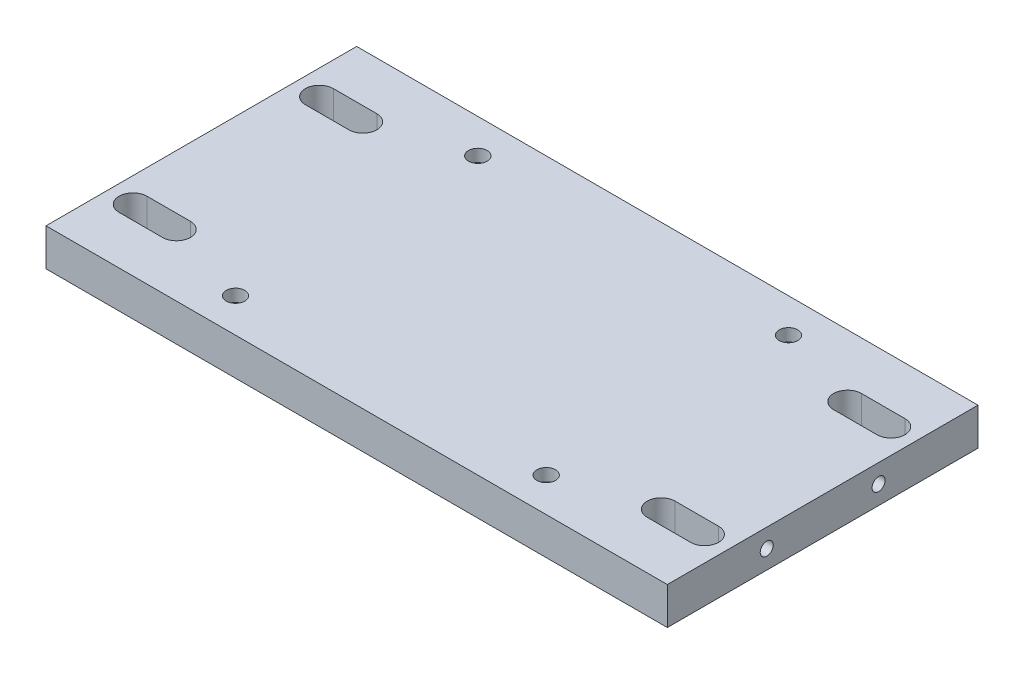
ISO-10303-21;
HEADER;
FILE_DESCRIPTION(('STEP AP214'),'2;1');
FILE_NAME('part.step','',(''),(''),'','','');
FILE_SCHEMA(('AUTOMOTIVE_DESIGN { 1 0 10303 214 1 1 1 1 }'));
ENDSEC;
DATA;
#1=APPLICATION_CONTEXT('core data for automotive mechanical design processes');
#2=APPLICATION_PROTOCOL_DEFINITION('international standard','automotive_design',2000,#1);
#3=PRODUCT_CONTEXT('',#1,'mechanical');
#4=PRODUCT('Part','Part','',(#3));
#5=PRODUCT_RELATED_PRODUCT_CATEGORY('part','',(#4));
#6=PRODUCT_DEFINITION_FORMATION('','',#4);
#7=PRODUCT_DEFINITION_CONTEXT('part definition',#1,'design');
#8=PRODUCT_DEFINITION('design','',#6,#7);
#9=PRODUCT_DEFINITION_SHAPE('','',#8);
#10=(LENGTH_UNIT() NAMED_UNIT(*) SI_UNIT(.MILLI.,.METRE.));
#11=(NAMED_UNIT(*) PLANE_ANGLE_UNIT() SI_UNIT($,.RADIAN.));
#12=(NAMED_UNIT(*) SI_UNIT($,.STERADIAN.) SOLID_ANGLE_UNIT());
#13=UNCERTAINTY_MEASURE_WITH_UNIT(LENGTH_MEASURE(1.E-05),#10,'distance_accuracy_value','');
#14=(GEOMETRIC_REPRESENTATION_CONTEXT(3) GLOBAL_UNCERTAINTY_ASSIGNED_CONTEXT((#13)) GLOBAL_UNIT_ASSIGNED_CONTEXT((#10,
#11,#12)) REPRESENTATION_CONTEXT('',''));
#15=CARTESIAN_POINT('',(0.,0.,0.));
#16=DIRECTION('',(0.,0.,1.));
#17=DIRECTION('',(1.,0.,0.));
#18=AXIS2_PLACEMENT_3D('',#15,#16,#17);
#19=CARTESIAN_POINT('',(-200.,12.,50.));
#20=DIRECTION('',(1.,0.,0.));
#21=DIRECTION('',(0.,0.,-1.));
#22=AXIS2_PLACEMENT_3D('',#19,#20,#21);
#23=PLANE('',#22);
#24=DIRECTION('',(0.,0.,1.));
#25=VECTOR('',#24,1.);
#26=CARTESIAN_POINT('',(-200.,0.,50.));
#27=LINE('',#26,#25);
#28=CARTESIAN_POINT('',(-200.,0.,-50.));
#29=VERTEX_POINT('',#28);
#30=CARTESIAN_POINT('',(-200.,0.,50.));
#31=VERTEX_POINT('',#30);
#32=EDGE_CURVE('E363',#29,#31,#27,.T.);
#33=ORIENTED_EDGE('',*,*,#32,.T.);
#34=DIRECTION('',(0.,-1.,0.));
#35=VECTOR('',#34,1.);
#36=CARTESIAN_POINT('',(-200.,12.,50.));
#37=LINE('',#36,#35);
#38=CARTESIAN_POINT('',(-200.,12.,50.));
#39=VERTEX_POINT('',#38);
#40=EDGE_CURVE('E11',#39,#31,#37,.T.);
#41=ORIENTED_EDGE('',*,*,#40,.F.);
#42=DIRECTION('',(0.,0.,1.));
#43=VECTOR('',#42,1.);
#44=CARTESIAN_POINT('',(-200.,12.,50.));
#45=LINE('',#44,#43);
#46=CARTESIAN_POINT('',(-200.,12.,-50.));
#47=VERTEX_POINT('',#46);
#48=EDGE_CURVE('E370',#47,#39,#45,.T.);
#49=ORIENTED_EDGE('',*,*,#48,.F.);
#50=DIRECTION('',(0.,-1.,0.));
#51=VECTOR('',#50,1.);
#52=CARTESIAN_POINT('',(-200.,12.,-50.));
#53=LINE('',#52,#51);
#54=EDGE_CURVE('E380',#47,#29,#53,.T.);
#55=ORIENTED_EDGE('',*,*,#54,.T.);
#56=EDGE_LOOP('',(#33,#41,#49,#55));
#57=FACE_BOUND('',#56,.T.);
#58=ADVANCED_FACE('F36',(#57),#23,.F.);
#59=CARTESIAN_POINT('',(-200.,12.,50.));
#60=DIRECTION('',(0.,0.,-1.));
#61=DIRECTION('',(-1.,0.,0.));
#62=AXIS2_PLACEMENT_3D('',#59,#60,#61);
#63=PLANE('',#62);
#64=DIRECTION('',(1.,0.,0.));
#65=VECTOR('',#64,1.);
#66=CARTESIAN_POINT('',(-200.,0.,50.));
#67=LINE('',#66,#65);
#68=CARTESIAN_POINT('',(0.,0.,50.));
#69=VERTEX_POINT('',#68);
#70=EDGE_CURVE('E383',#31,#69,#67,.T.);
#71=ORIENTED_EDGE('',*,*,#70,.T.);
#72=DIRECTION('',(0.,-1.,0.));
#73=VECTOR('',#72,1.);
#74=CARTESIAN_POINT('',(0.,12.,50.));
#75=LINE('',#74,#73);
#76=CARTESIAN_POINT('',(0.,12.,50.));
#77=VERTEX_POINT('',#76);
#78=EDGE_CURVE('E43',#77,#69,#75,.T.);
#79=ORIENTED_EDGE('',*,*,#78,.F.);
#80=DIRECTION('',(1.,0.,0.));
#81=VECTOR('',#80,1.);
#82=CARTESIAN_POINT('',(-200.,12.,50.));
#83=LINE('',#82,#81);
#84=EDGE_CURVE('E373',#39,#77,#83,.T.);
#85=ORIENTED_EDGE('',*,*,#84,.F.);
#86=ORIENTED_EDGE('',*,*,#40,.T.);
#87=EDGE_LOOP('',(#71,#79,#85,#86));
#88=FACE_BOUND('',#87,.T.);
#89=ADVANCED_FACE('F413',(#88),#63,.F.);
#90=CARTESIAN_POINT('',(0.,12.,50.));
#91=DIRECTION('',(-1.,0.,0.));
#92=DIRECTION('',(0.,0.,1.));
#93=AXIS2_PLACEMENT_3D('',#90,#91,#92);
#94=PLANE('',#93);
#95=CARTESIAN_POINT('',(0.,6.,-18.));
#96=DIRECTION('',(1.,0.,0.));
#97=DIRECTION('',(0.,0.,-1.));
#98=AXIS2_PLACEMENT_3D('',#95,#96,#97);
#99=CIRCLE('',#98,2.1);
#100=CARTESIAN_POINT('',(0.,6.,-20.1));
#101=VERTEX_POINT('',#100);
#102=EDGE_CURVE('E187',#101,#101,#99,.T.);
#103=ORIENTED_EDGE('',*,*,#102,.F.);
#104=EDGE_LOOP('',(#103));
#105=FACE_BOUND('',#104,.T.);
#106=CARTESIAN_POINT('',(0.,6.,18.));
#107=DIRECTION('',(1.,0.,0.));
#108=DIRECTION('',(0.,0.,-1.));
#109=AXIS2_PLACEMENT_3D('',#106,#107,#108);
#110=CIRCLE('',#109,2.1);
#111=CARTESIAN_POINT('',(0.,6.,15.9));
#112=VERTEX_POINT('',#111);
#113=EDGE_CURVE('E186',#112,#112,#110,.T.);
#114=ORIENTED_EDGE('',*,*,#113,.F.);
#115=EDGE_LOOP('',(#114));
#116=FACE_BOUND('',#115,.T.);
#117=DIRECTION('',(0.,0.,-1.));
#118=VECTOR('',#117,1.);
#119=CARTESIAN_POINT('',(0.,0.,50.));
#120=LINE('',#119,#118);
#121=CARTESIAN_POINT('',(0.,0.,-50.));
#122=VERTEX_POINT('',#121);
#123=EDGE_CURVE('E385',#69,#122,#120,.T.);
#124=ORIENTED_EDGE('',*,*,#123,.T.);
#125=DIRECTION('',(0.,-1.,0.));
#126=VECTOR('',#125,1.);
#127=CARTESIAN_POINT('',(0.,12.,-50.));
#128=LINE('',#127,#126);
#129=CARTESIAN_POINT('',(0.,12.,-50.));
#130=VERTEX_POINT('',#129);
#131=EDGE_CURVE('E390',#130,#122,#128,.T.);
#132=ORIENTED_EDGE('',*,*,#131,.F.);
#133=DIRECTION('',(0.,0.,-1.));
#134=VECTOR('',#133,1.);
#135=CARTESIAN_POINT('',(0.,12.,50.));
#136=LINE('',#135,#134);
#137=EDGE_CURVE('E376',#77,#130,#136,.T.);
#138=ORIENTED_EDGE('',*,*,#137,.F.);
#139=ORIENTED_EDGE('',*,*,#78,.T.);
#140=EDGE_LOOP('',(#124,#132,#138,#139));
#141=FACE_BOUND('',#140,.T.);
#142=ADVANCED_FACE('F397',(#105,#116,#141),#94,.F.);
#143=CARTESIAN_POINT('',(-200.,12.,-50.));
#144=DIRECTION('',(0.,0.,1.));
#145=DIRECTION('',(1.,0.,0.));
#146=AXIS2_PLACEMENT_3D('',#143,#144,#145);
#147=PLANE('',#146);
#148=DIRECTION('',(-1.,0.,0.));
#149=VECTOR('',#148,1.);
#150=CARTESIAN_POINT('',(-200.,0.,-50.));
#151=LINE('',#150,#149);
#152=EDGE_CURVE('E374',#122,#29,#151,.T.);
#153=ORIENTED_EDGE('',*,*,#152,.T.);
#154=ORIENTED_EDGE('',*,*,#54,.F.);
#155=DIRECTION('',(-1.,0.,0.));
#156=VECTOR('',#155,1.);
#157=CARTESIAN_POINT('',(-200.,12.,-50.));
#158=LINE('',#157,#156);
#159=EDGE_CURVE('E378',#130,#47,#158,.T.);
#160=ORIENTED_EDGE('',*,*,#159,.F.);
#161=ORIENTED_EDGE('',*,*,#131,.T.);
#162=EDGE_LOOP('',(#153,#154,#160,#161));
#163=FACE_BOUND('',#162,.T.);
#164=ADVANCED_FACE('F406',(#163),#147,.F.);
#165=CARTESIAN_POINT('',(-200.,12.,-50.));
#166=DIRECTION('',(0.,-1.,0.));
#167=DIRECTION('',(0.,0.,-1.));
#168=AXIS2_PLACEMENT_3D('',#165,#166,#167);
#169=PLANE('',#168);
#170=CARTESIAN_POINT('',(-150.,12.,39.));
#171=DIRECTION('',(0.,-1.,0.));
#172=DIRECTION('',(0.,0.,-1.));
#173=AXIS2_PLACEMENT_3D('',#170,#171,#172);
#174=CIRCLE('',#173,3.);
#175=CARTESIAN_POINT('',(-150.,12.,36.));
#176=VERTEX_POINT('',#175);
#177=EDGE_CURVE('E206',#176,#176,#174,.T.);
#178=ORIENTED_EDGE('',*,*,#177,.T.);
#179=EDGE_LOOP('',(#178));
#180=FACE_BOUND('',#179,.T.);
#181=CARTESIAN_POINT('',(-50.,12.,39.));
#182=DIRECTION('',(0.,-1.,0.));
#183=DIRECTION('',(0.,0.,-1.));
#184=AXIS2_PLACEMENT_3D('',#181,#182,#183);
#185=CIRCLE('',#184,3.);
#186=CARTESIAN_POINT('',(-50.,12.,36.));
#187=VERTEX_POINT('',#186);
#188=EDGE_CURVE('E218',#187,#187,#185,.T.);
#189=ORIENTED_EDGE('',*,*,#188,.T.);
#190=EDGE_LOOP('',(#189));
#191=FACE_BOUND('',#190,.T.);
#192=CARTESIAN_POINT('',(-150.,12.,-39.));
#193=DIRECTION('',(0.,-1.,0.));
#194=DIRECTION('',(0.,0.,-1.));
#195=AXIS2_PLACEMENT_3D('',#192,#193,#194);
#196=CIRCLE('',#195,3.);
#197=CARTESIAN_POINT('',(-150.,12.,-42.));
#198=VERTEX_POINT('',#197);
#199=EDGE_CURVE('E230',#198,#198,#196,.T.);
#200=ORIENTED_EDGE('',*,*,#199,.T.);
#201=EDGE_LOOP('',(#200));
#202=FACE_BOUND('',#201,.T.);
#203=CARTESIAN_POINT('',(-50.,12.,-39.));
#204=DIRECTION('',(0.,-1.,0.));
#205=DIRECTION('',(0.,0.,-1.));
#206=AXIS2_PLACEMENT_3D('',#203,#204,#205);
#207=CIRCLE('',#206,3.);
#208=CARTESIAN_POINT('',(-50.,12.,-42.));
#209=VERTEX_POINT('',#208);
#210=EDGE_CURVE('E242',#209,#209,#207,.T.);
#211=ORIENTED_EDGE('',*,*,#210,.T.);
#212=EDGE_LOOP('',(#211));
#213=FACE_BOUND('',#212,.T.);
#214=DIRECTION('',(1.,0.,0.));
#215=VECTOR('',#214,1.);
#216=CARTESIAN_POINT('',(-22.,12.,34.5));
#217=LINE('',#216,#215);
#218=CARTESIAN_POINT('',(-22.,12.,34.5));
#219=VERTEX_POINT('',#218);
#220=CARTESIAN_POINT('',(-8.00000000000001,12.,34.5));
#221=VERTEX_POINT('',#220);
#222=EDGE_CURVE('E258',#219,#221,#217,.T.);
#223=ORIENTED_EDGE('',*,*,#222,.F.);
#224=CARTESIAN_POINT('',(-22.,12.,30.));
#225=DIRECTION('',(0.,1.,0.));
#226=DIRECTION('',(0.,0.,1.));
#227=AXIS2_PLACEMENT_3D('',#224,#225,#226);
#228=CIRCLE('',#227,4.5);
#229=CARTESIAN_POINT('',(-22.,12.,25.5));
#230=VERTEX_POINT('',#229);
#231=EDGE_CURVE('E50',#230,#219,#228,.T.);
#232=ORIENTED_EDGE('',*,*,#231,.F.);
#233=DIRECTION('',(-1.,0.,0.));
#234=VECTOR('',#233,1.);
#235=CARTESIAN_POINT('',(-22.,12.,25.5));
#236=LINE('',#235,#234);
#237=CARTESIAN_POINT('',(-8.00000000000001,12.,25.5));
#238=VERTEX_POINT('',#237);
#239=EDGE_CURVE('E249',#238,#230,#236,.T.);
#240=ORIENTED_EDGE('',*,*,#239,.F.);
#241=CARTESIAN_POINT('',(-8.00000000000001,12.,30.));
#242=DIRECTION('',(0.,1.,0.));
#243=DIRECTION('',(0.,0.,1.));
#244=AXIS2_PLACEMENT_3D('',#241,#242,#243);
#245=CIRCLE('',#244,4.5);
#246=EDGE_CURVE('E261',#221,#238,#245,.T.);
#247=ORIENTED_EDGE('',*,*,#246,.F.);
#248=EDGE_LOOP('',(#223,#232,#240,#247));
#249=FACE_BOUND('',#248,.T.);
#250=DIRECTION('',(1.,0.,0.));
#251=VECTOR('',#250,1.);
#252=CARTESIAN_POINT('',(-22.,12.,-25.5));
#253=LINE('',#252,#251);
#254=CARTESIAN_POINT('',(-22.,12.,-25.5));
#255=VERTEX_POINT('',#254);
#256=CARTESIAN_POINT('',(-8.00000000000002,12.,-25.5));
#257=VERTEX_POINT('',#256);
#258=EDGE_CURVE('E289',#255,#257,#253,.T.);
#259=ORIENTED_EDGE('',*,*,#258,.F.);
#260=CARTESIAN_POINT('',(-22.,12.,-30.));
#261=DIRECTION('',(0.,1.,0.));
#262=DIRECTION('',(0.,0.,1.));
#263=AXIS2_PLACEMENT_3D('',#260,#261,#262);
#264=CIRCLE('',#263,4.5);
#265=CARTESIAN_POINT('',(-22.,12.,-34.5));
#266=VERTEX_POINT('',#265);
#267=EDGE_CURVE('E268',#266,#255,#264,.T.);
#268=ORIENTED_EDGE('',*,*,#267,.F.);
#269=DIRECTION('',(-1.,0.,0.));
#270=VECTOR('',#269,1.);
#271=CARTESIAN_POINT('',(-22.,12.,-34.5));
#272=LINE('',#271,#270);
#273=CARTESIAN_POINT('',(-8.00000000000002,12.,-34.5));
#274=VERTEX_POINT('',#273);
#275=EDGE_CURVE('E278',#274,#266,#272,.T.);
#276=ORIENTED_EDGE('',*,*,#275,.F.);
#277=CARTESIAN_POINT('',(-8.00000000000002,12.,-30.));
#278=DIRECTION('',(0.,1.,0.));
#279=DIRECTION('',(0.,0.,1.));
#280=AXIS2_PLACEMENT_3D('',#277,#278,#279);
#281=CIRCLE('',#280,4.5);
#282=EDGE_CURVE('E292',#257,#274,#281,.T.);
#283=ORIENTED_EDGE('',*,*,#282,.F.);
#284=EDGE_LOOP('',(#259,#268,#276,#283));
#285=FACE_BOUND('',#284,.T.);
#286=DIRECTION('',(1.,0.,0.));
#287=VECTOR('',#286,1.);
#288=CARTESIAN_POINT('',(-192.,12.,-25.5));
#289=LINE('',#288,#287);
#290=CARTESIAN_POINT('',(-192.,12.,-25.5));
#291=VERTEX_POINT('',#290);
#292=CARTESIAN_POINT('',(-178.,12.,-25.5));
#293=VERTEX_POINT('',#292);
#294=EDGE_CURVE('E321',#291,#293,#289,.T.);
#295=ORIENTED_EDGE('',*,*,#294,.F.);
#296=CARTESIAN_POINT('',(-192.,12.,-30.));
#297=DIRECTION('',(0.,1.,0.));
#298=DIRECTION('',(0.,0.,1.));
#299=AXIS2_PLACEMENT_3D('',#296,#297,#298);
#300=CIRCLE('',#299,4.5);
#301=CARTESIAN_POINT('',(-192.,12.,-34.5));
#302=VERTEX_POINT('',#301);
#303=EDGE_CURVE('E299',#302,#291,#300,.T.);
#304=ORIENTED_EDGE('',*,*,#303,.F.);
#305=DIRECTION('',(-1.,0.,0.));
#306=VECTOR('',#305,1.);
#307=CARTESIAN_POINT('',(-192.,12.,-34.5));
#308=LINE('',#307,#306);
#309=CARTESIAN_POINT('',(-178.,12.,-34.5));
#310=VERTEX_POINT('',#309);
#311=EDGE_CURVE('E310',#310,#302,#308,.T.);
#312=ORIENTED_EDGE('',*,*,#311,.F.);
#313=CARTESIAN_POINT('',(-178.,12.,-30.));
#314=DIRECTION('',(0.,1.,0.));
#315=DIRECTION('',(0.,0.,1.));
#316=AXIS2_PLACEMENT_3D('',#313,#314,#315);
#317=CIRCLE('',#316,4.5);
#318=EDGE_CURVE('E324',#293,#310,#317,.T.);
#319=ORIENTED_EDGE('',*,*,#318,.F.);
#320=EDGE_LOOP('',(#295,#304,#312,#319));
#321=FACE_BOUND('',#320,.T.);
#322=DIRECTION('',(1.,0.,0.));
#323=VECTOR('',#322,1.);
#324=CARTESIAN_POINT('',(-192.,12.,34.5));
#325=LINE('',#324,#323);
#326=CARTESIAN_POINT('',(-192.,12.,34.5));
#327=VERTEX_POINT('',#326);
#328=CARTESIAN_POINT('',(-178.,12.,34.5));
#329=VERTEX_POINT('',#328);
#330=EDGE_CURVE('E353',#327,#329,#325,.T.);
#331=ORIENTED_EDGE('',*,*,#330,.F.);
#332=CARTESIAN_POINT('',(-192.,12.,30.));
#333=DIRECTION('',(0.,1.,0.));
#334=DIRECTION('',(0.,0.,1.));
#335=AXIS2_PLACEMENT_3D('',#332,#333,#334);
#336=CIRCLE('',#335,4.5);
#337=CARTESIAN_POINT('',(-192.,12.,25.5));
#338=VERTEX_POINT('',#337);
#339=EDGE_CURVE('E331',#338,#327,#336,.T.);
#340=ORIENTED_EDGE('',*,*,#339,.F.);
#341=DIRECTION('',(-1.,0.,0.));
#342=VECTOR('',#341,1.);
#343=CARTESIAN_POINT('',(-192.,12.,25.5));
#344=LINE('',#343,#342);
#345=CARTESIAN_POINT('',(-178.,12.,25.5));
#346=VERTEX_POINT('',#345);
#347=EDGE_CURVE('E342',#346,#338,#344,.T.);
#348=ORIENTED_EDGE('',*,*,#347,.F.);
#349=CARTESIAN_POINT('',(-178.,12.,30.));
#350=DIRECTION('',(0.,1.,0.));
#351=DIRECTION('',(0.,0.,1.));
#352=AXIS2_PLACEMENT_3D('',#349,#350,#351);
#353=CIRCLE('',#352,4.5);
#354=EDGE_CURVE('E356',#329,#346,#353,.T.);
#355=ORIENTED_EDGE('',*,*,#354,.F.);
#356=EDGE_LOOP('',(#331,#340,#348,#355));
#357=FACE_BOUND('',#356,.T.);
#358=ORIENTED_EDGE('',*,*,#48,.T.);
#359=ORIENTED_EDGE('',*,*,#84,.T.);
#360=ORIENTED_EDGE('',*,*,#137,.T.);
#361=ORIENTED_EDGE('',*,*,#159,.T.);
#362=EDGE_LOOP('',(#358,#359,#360,#361));
#363=FACE_BOUND('',#362,.T.);
#364=ADVANCED_FACE('F412',(#180,#191,#202,#213,#249,#285,#321,#357,#363),#169,.F.);
#365=CARTESIAN_POINT('',(-200.,0.,-50.));
#366=DIRECTION('',(0.,-1.,0.));
#367=DIRECTION('',(0.,0.,-1.));
#368=AXIS2_PLACEMENT_3D('',#365,#366,#367);
#369=PLANE('',#368);
#370=CARTESIAN_POINT('',(-150.,0.,39.));
#371=DIRECTION('',(0.,-1.,0.));
#372=DIRECTION('',(0.,0.,-1.));
#373=AXIS2_PLACEMENT_3D('',#370,#371,#372);
#374=CIRCLE('',#373,5.50000000000001);
#375=CARTESIAN_POINT('',(-150.,0.,33.5));
#376=VERTEX_POINT('',#375);
#377=EDGE_CURVE('E197',#376,#376,#374,.T.);
#378=ORIENTED_EDGE('',*,*,#377,.F.);
#379=EDGE_LOOP('',(#378));
#380=FACE_BOUND('',#379,.T.);
#381=CARTESIAN_POINT('',(-50.,0.,39.));
#382=DIRECTION('',(0.,-1.,0.));
#383=DIRECTION('',(0.,0.,-1.));
#384=AXIS2_PLACEMENT_3D('',#381,#382,#383);
#385=CIRCLE('',#384,5.5);
#386=CARTESIAN_POINT('',(-50.,0.,33.5));
#387=VERTEX_POINT('',#386);
#388=EDGE_CURVE('E209',#387,#387,#385,.T.);
#389=ORIENTED_EDGE('',*,*,#388,.F.);
#390=EDGE_LOOP('',(#389));
#391=FACE_BOUND('',#390,.T.);
#392=CARTESIAN_POINT('',(-150.,0.,-39.));
#393=DIRECTION('',(0.,-1.,0.));
#394=DIRECTION('',(0.,0.,-1.));
#395=AXIS2_PLACEMENT_3D('',#392,#393,#394);
#396=CIRCLE('',#395,5.50000000000001);
#397=CARTESIAN_POINT('',(-150.,0.,-44.5));
#398=VERTEX_POINT('',#397);
#399=EDGE_CURVE('E221',#398,#398,#396,.T.);
#400=ORIENTED_EDGE('',*,*,#399,.F.);
#401=EDGE_LOOP('',(#400));
#402=FACE_BOUND('',#401,.T.);
#403=CARTESIAN_POINT('',(-50.,0.,-39.));
#404=DIRECTION('',(0.,-1.,0.));
#405=DIRECTION('',(0.,0.,-1.));
#406=AXIS2_PLACEMENT_3D('',#403,#404,#405);
#407=CIRCLE('',#406,5.5);
#408=CARTESIAN_POINT('',(-50.,0.,-44.5));
#409=VERTEX_POINT('',#408);
#410=EDGE_CURVE('E233',#409,#409,#407,.T.);
#411=ORIENTED_EDGE('',*,*,#410,.F.);
#412=EDGE_LOOP('',(#411));
#413=FACE_BOUND('',#412,.T.);
#414=CARTESIAN_POINT('',(-22.,0.,30.));
#415=DIRECTION('',(0.,1.,0.));
#416=DIRECTION('',(0.,0.,1.));
#417=AXIS2_PLACEMENT_3D('',#414,#415,#416);
#418=CIRCLE('',#417,4.5);
#419=CARTESIAN_POINT('',(-22.,0.,25.5));
#420=VERTEX_POINT('',#419);
#421=CARTESIAN_POINT('',(-22.,0.,34.5));
#422=VERTEX_POINT('',#421);
#423=EDGE_CURVE('E245',#420,#422,#418,.T.);
#424=ORIENTED_EDGE('',*,*,#423,.T.);
#425=DIRECTION('',(1.,0.,0.));
#426=VECTOR('',#425,1.);
#427=CARTESIAN_POINT('',(-22.,0.,34.5));
#428=LINE('',#427,#426);
#429=CARTESIAN_POINT('',(-8.00000000000001,0.,34.5));
#430=VERTEX_POINT('',#429);
#431=EDGE_CURVE('E248',#422,#430,#428,.T.);
#432=ORIENTED_EDGE('',*,*,#431,.T.);
#433=CARTESIAN_POINT('',(-8.00000000000001,0.,30.));
#434=DIRECTION('',(0.,1.,0.));
#435=DIRECTION('',(0.,0.,1.));
#436=AXIS2_PLACEMENT_3D('',#433,#434,#435);
#437=CIRCLE('',#436,4.5);
#438=CARTESIAN_POINT('',(-8.00000000000001,0.,25.5));
#439=VERTEX_POINT('',#438);
#440=EDGE_CURVE('E58',#430,#439,#437,.T.);
#441=ORIENTED_EDGE('',*,*,#440,.T.);
#442=DIRECTION('',(-1.,0.,0.));
#443=VECTOR('',#442,1.);
#444=CARTESIAN_POINT('',(-22.,0.,25.5));
#445=LINE('',#444,#443);
#446=EDGE_CURVE('E253',#439,#420,#445,.T.);
#447=ORIENTED_EDGE('',*,*,#446,.T.);
#448=EDGE_LOOP('',(#424,#432,#441,#447));
#449=FACE_BOUND('',#448,.T.);
#450=CARTESIAN_POINT('',(-22.,0.,-30.));
#451=DIRECTION('',(0.,1.,0.));
#452=DIRECTION('',(0.,0.,1.));
#453=AXIS2_PLACEMENT_3D('',#450,#451,#452);
#454=CIRCLE('',#453,4.5);
#455=CARTESIAN_POINT('',(-22.,0.,-34.5));
#456=VERTEX_POINT('',#455);
#457=CARTESIAN_POINT('',(-22.,0.,-25.5));
#458=VERTEX_POINT('',#457);
#459=EDGE_CURVE('E274',#456,#458,#454,.T.);
#460=ORIENTED_EDGE('',*,*,#459,.T.);
#461=DIRECTION('',(1.,0.,0.));
#462=VECTOR('',#461,1.);
#463=CARTESIAN_POINT('',(-22.,0.,-25.5));
#464=LINE('',#463,#462);
#465=CARTESIAN_POINT('',(-8.00000000000004,0.,-25.5));
#466=VERTEX_POINT('',#465);
#467=EDGE_CURVE('E277',#458,#466,#464,.T.);
#468=ORIENTED_EDGE('',*,*,#467,.T.);
#469=CARTESIAN_POINT('',(-8.00000000000002,0.,-30.));
#470=DIRECTION('',(0.,1.,0.));
#471=DIRECTION('',(0.,0.,1.));
#472=AXIS2_PLACEMENT_3D('',#469,#470,#471);
#473=CIRCLE('',#472,4.5);
#474=CARTESIAN_POINT('',(-8.00000000000002,0.,-34.5));
#475=VERTEX_POINT('',#474);
#476=EDGE_CURVE('E281',#466,#475,#473,.T.);
#477=ORIENTED_EDGE('',*,*,#476,.T.);
#478=DIRECTION('',(-1.,0.,0.));
#479=VECTOR('',#478,1.);
#480=CARTESIAN_POINT('',(-22.,0.,-34.5));
#481=LINE('',#480,#479);
#482=EDGE_CURVE('E284',#475,#456,#481,.T.);
#483=ORIENTED_EDGE('',*,*,#482,.T.);
#484=EDGE_LOOP('',(#460,#468,#477,#483));
#485=FACE_BOUND('',#484,.T.);
#486=CARTESIAN_POINT('',(-192.,0.,-30.));
#487=DIRECTION('',(0.,1.,0.));
#488=DIRECTION('',(0.,0.,1.));
#489=AXIS2_PLACEMENT_3D('',#486,#487,#488);
#490=CIRCLE('',#489,4.5);
#491=CARTESIAN_POINT('',(-192.,0.,-34.5));
#492=VERTEX_POINT('',#491);
#493=CARTESIAN_POINT('',(-192.,0.,-25.5));
#494=VERTEX_POINT('',#493);
#495=EDGE_CURVE('E306',#492,#494,#490,.T.);
#496=ORIENTED_EDGE('',*,*,#495,.T.);
#497=DIRECTION('',(1.,0.,0.));
#498=VECTOR('',#497,1.);
#499=CARTESIAN_POINT('',(-192.,0.,-25.5));
#500=LINE('',#499,#498);
#501=CARTESIAN_POINT('',(-178.,0.,-25.5));
#502=VERTEX_POINT('',#501);
#503=EDGE_CURVE('E309',#494,#502,#500,.T.);
#504=ORIENTED_EDGE('',*,*,#503,.T.);
#505=CARTESIAN_POINT('',(-178.,0.,-30.));
#506=DIRECTION('',(0.,1.,0.));
#507=DIRECTION('',(0.,0.,1.));
#508=AXIS2_PLACEMENT_3D('',#505,#506,#507);
#509=CIRCLE('',#508,4.5);
#510=CARTESIAN_POINT('',(-178.,0.,-34.5));
#511=VERTEX_POINT('',#510);
#512=EDGE_CURVE('E313',#502,#511,#509,.T.);
#513=ORIENTED_EDGE('',*,*,#512,.T.);
#514=DIRECTION('',(-1.,0.,0.));
#515=VECTOR('',#514,1.);
#516=CARTESIAN_POINT('',(-192.,0.,-34.5));
#517=LINE('',#516,#515);
#518=EDGE_CURVE('E316',#511,#492,#517,.T.);
#519=ORIENTED_EDGE('',*,*,#518,.T.);
#520=EDGE_LOOP('',(#496,#504,#513,#519));
#521=FACE_BOUND('',#520,.T.);
#522=CARTESIAN_POINT('',(-192.,0.,30.));
#523=DIRECTION('',(0.,1.,0.));
#524=DIRECTION('',(0.,0.,1.));
#525=AXIS2_PLACEMENT_3D('',#522,#523,#524);
#526=CIRCLE('',#525,4.5);
#527=CARTESIAN_POINT('',(-192.,0.,25.5));
#528=VERTEX_POINT('',#527);
#529=CARTESIAN_POINT('',(-192.,0.,34.5));
#530=VERTEX_POINT('',#529);
#531=EDGE_CURVE('E338',#528,#530,#526,.T.);
#532=ORIENTED_EDGE('',*,*,#531,.T.);
#533=DIRECTION('',(1.,0.,0.));
#534=VECTOR('',#533,1.);
#535=CARTESIAN_POINT('',(-192.,0.,34.5));
#536=LINE('',#535,#534);
#537=CARTESIAN_POINT('',(-178.,0.,34.5));
#538=VERTEX_POINT('',#537);
#539=EDGE_CURVE('E341',#530,#538,#536,.T.);
#540=ORIENTED_EDGE('',*,*,#539,.T.);
#541=CARTESIAN_POINT('',(-178.,0.,30.));
#542=DIRECTION('',(0.,1.,0.));
#543=DIRECTION('',(0.,0.,1.));
#544=AXIS2_PLACEMENT_3D('',#541,#542,#543);
#545=CIRCLE('',#544,4.5);
#546=CARTESIAN_POINT('',(-178.,0.,25.5));
#547=VERTEX_POINT('',#546);
#548=EDGE_CURVE('E345',#538,#547,#545,.T.);
#549=ORIENTED_EDGE('',*,*,#548,.T.);
#550=DIRECTION('',(-1.,0.,0.));
#551=VECTOR('',#550,1.);
#552=CARTESIAN_POINT('',(-192.,0.,25.5));
#553=LINE('',#552,#551);
#554=EDGE_CURVE('E348',#547,#528,#553,.T.);
#555=ORIENTED_EDGE('',*,*,#554,.T.);
#556=EDGE_LOOP('',(#532,#540,#549,#555));
#557=FACE_BOUND('',#556,.T.);
#558=ORIENTED_EDGE('',*,*,#32,.F.);
#559=ORIENTED_EDGE('',*,*,#152,.F.);
#560=ORIENTED_EDGE('',*,*,#123,.F.);
#561=ORIENTED_EDGE('',*,*,#70,.F.);
#562=EDGE_LOOP('',(#558,#559,#560,#561));
#563=FACE_BOUND('',#562,.T.);
#564=ADVANCED_FACE('F403',(#380,#391,#402,#413,#449,#485,#521,#557,#563),#369,.T.);
#565=CARTESIAN_POINT('',(-192.,0.,30.));
#566=DIRECTION('',(0.,1.,0.));
#567=DIRECTION('',(0.,0.,1.));
#568=AXIS2_PLACEMENT_3D('',#565,#566,#567);
#569=CYLINDRICAL_SURFACE('',#568,4.5);
#570=ORIENTED_EDGE('',*,*,#339,.T.);
#571=DIRECTION('',(0.,1.,0.));
#572=VECTOR('',#571,1.);
#573=CARTESIAN_POINT('',(-192.,0.,34.5));
#574=LINE('',#573,#572);
#575=EDGE_CURVE('E351',#530,#327,#574,.T.);
#576=ORIENTED_EDGE('',*,*,#575,.F.);
#577=ORIENTED_EDGE('',*,*,#531,.F.);
#578=DIRECTION('',(0.,1.,0.));
#579=VECTOR('',#578,1.);
#580=CARTESIAN_POINT('',(-192.,0.,25.5));
#581=LINE('',#580,#579);
#582=EDGE_CURVE('E361',#528,#338,#581,.T.);
#583=ORIENTED_EDGE('',*,*,#582,.T.);
#584=EDGE_LOOP('',(#570,#576,#577,#583));
#585=FACE_BOUND('',#584,.T.);
#586=ADVANCED_FACE('F426',(#585),#569,.F.);
#587=CARTESIAN_POINT('',(-192.,0.,25.5));
#588=DIRECTION('',(0.,0.,-1.));
#589=DIRECTION('',(-1.,0.,0.));
#590=AXIS2_PLACEMENT_3D('',#587,#588,#589);
#591=PLANE('',#590);
#592=ORIENTED_EDGE('',*,*,#347,.T.);
#593=ORIENTED_EDGE('',*,*,#582,.F.);
#594=ORIENTED_EDGE('',*,*,#554,.F.);
#595=DIRECTION('',(0.,1.,0.));
#596=VECTOR('',#595,1.);
#597=CARTESIAN_POINT('',(-178.,0.,25.5));
#598=LINE('',#597,#596);
#599=EDGE_CURVE('E364',#547,#346,#598,.T.);
#600=ORIENTED_EDGE('',*,*,#599,.T.);
#601=EDGE_LOOP('',(#592,#593,#594,#600));
#602=FACE_BOUND('',#601,.T.);
#603=ADVANCED_FACE('F433',(#602),#591,.F.);
#604=CARTESIAN_POINT('',(-178.,0.,30.));
#605=DIRECTION('',(0.,1.,0.));
#606=DIRECTION('',(0.,0.,1.));
#607=AXIS2_PLACEMENT_3D('',#604,#605,#606);
#608=CYLINDRICAL_SURFACE('',#607,4.5);
#609=ORIENTED_EDGE('',*,*,#354,.T.);
#610=ORIENTED_EDGE('',*,*,#599,.F.);
#611=ORIENTED_EDGE('',*,*,#548,.F.);
#612=DIRECTION('',(0.,1.,0.));
#613=VECTOR('',#612,1.);
#614=CARTESIAN_POINT('',(-178.,0.,34.5));
#615=LINE('',#614,#613);
#616=EDGE_CURVE('E366',#538,#329,#615,.T.);
#617=ORIENTED_EDGE('',*,*,#616,.T.);
#618=EDGE_LOOP('',(#609,#610,#611,#617));
#619=FACE_BOUND('',#618,.T.);
#620=ADVANCED_FACE('F439',(#619),#608,.F.);
#621=CARTESIAN_POINT('',(-192.,0.,34.5));
#622=DIRECTION('',(0.,0.,1.));
#623=DIRECTION('',(1.,0.,0.));
#624=AXIS2_PLACEMENT_3D('',#621,#622,#623);
#625=PLANE('',#624);
#626=ORIENTED_EDGE('',*,*,#330,.T.);
#627=ORIENTED_EDGE('',*,*,#616,.F.);
#628=ORIENTED_EDGE('',*,*,#539,.F.);
#629=ORIENTED_EDGE('',*,*,#575,.T.);
#630=EDGE_LOOP('',(#626,#627,#628,#629));
#631=FACE_BOUND('',#630,.T.);
#632=ADVANCED_FACE('F435',(#631),#625,.F.);
#633=CARTESIAN_POINT('',(-192.,0.,-30.));
#634=DIRECTION('',(0.,1.,0.));
#635=DIRECTION('',(0.,0.,1.));
#636=AXIS2_PLACEMENT_3D('',#633,#634,#635);
#637=CYLINDRICAL_SURFACE('',#636,4.5);
#638=ORIENTED_EDGE('',*,*,#303,.T.);
#639=DIRECTION('',(0.,1.,0.));
#640=VECTOR('',#639,1.);
#641=CARTESIAN_POINT('',(-192.,0.,-25.5));
#642=LINE('',#641,#640);
#643=EDGE_CURVE('E319',#494,#291,#642,.T.);
#644=ORIENTED_EDGE('',*,*,#643,.F.);
#645=ORIENTED_EDGE('',*,*,#495,.F.);
#646=DIRECTION('',(0.,1.,0.));
#647=VECTOR('',#646,1.);
#648=CARTESIAN_POINT('',(-192.,0.,-34.5));
#649=LINE('',#648,#647);
#650=EDGE_CURVE('E329',#492,#302,#649,.T.);
#651=ORIENTED_EDGE('',*,*,#650,.T.);
#652=EDGE_LOOP('',(#638,#644,#645,#651));
#653=FACE_BOUND('',#652,.T.);
#654=ADVANCED_FACE('F438',(#653),#637,.F.);
#655=CARTESIAN_POINT('',(-192.,0.,-34.5));
#656=DIRECTION('',(0.,0.,-1.));
#657=DIRECTION('',(-1.,0.,0.));
#658=AXIS2_PLACEMENT_3D('',#655,#656,#657);
#659=PLANE('',#658);
#660=ORIENTED_EDGE('',*,*,#311,.T.);
#661=ORIENTED_EDGE('',*,*,#650,.F.);
#662=ORIENTED_EDGE('',*,*,#518,.F.);
#663=DIRECTION('',(0.,1.,0.));
#664=VECTOR('',#663,1.);
#665=CARTESIAN_POINT('',(-178.,0.,-34.5));
#666=LINE('',#665,#664);
#667=EDGE_CURVE('E332',#511,#310,#666,.T.);
#668=ORIENTED_EDGE('',*,*,#667,.T.);
#669=EDGE_LOOP('',(#660,#661,#662,#668));
#670=FACE_BOUND('',#669,.T.);
#671=ADVANCED_FACE('F449',(#670),#659,.F.);
#672=CARTESIAN_POINT('',(-178.,0.,-30.));
#673=DIRECTION('',(0.,1.,0.));
#674=DIRECTION('',(0.,0.,1.));
#675=AXIS2_PLACEMENT_3D('',#672,#673,#674);
#676=CYLINDRICAL_SURFACE('',#675,4.5);
#677=ORIENTED_EDGE('',*,*,#318,.T.);
#678=ORIENTED_EDGE('',*,*,#667,.F.);
#679=ORIENTED_EDGE('',*,*,#512,.F.);
#680=DIRECTION('',(0.,1.,0.));
#681=VECTOR('',#680,1.);
#682=CARTESIAN_POINT('',(-178.,0.,-25.5));
#683=LINE('',#682,#681);
#684=EDGE_CURVE('E334',#502,#293,#683,.T.);
#685=ORIENTED_EDGE('',*,*,#684,.T.);
#686=EDGE_LOOP('',(#677,#678,#679,#685));
#687=FACE_BOUND('',#686,.T.);
#688=ADVANCED_FACE('F455',(#687),#676,.F.);
#689=CARTESIAN_POINT('',(-192.,0.,-25.5));
#690=DIRECTION('',(0.,0.,1.));
#691=DIRECTION('',(1.,0.,0.));
#692=AXIS2_PLACEMENT_3D('',#689,#690,#691);
#693=PLANE('',#692);
#694=ORIENTED_EDGE('',*,*,#294,.T.);
#695=ORIENTED_EDGE('',*,*,#684,.F.);
#696=ORIENTED_EDGE('',*,*,#503,.F.);
#697=ORIENTED_EDGE('',*,*,#643,.T.);
#698=EDGE_LOOP('',(#694,#695,#696,#697));
#699=FACE_BOUND('',#698,.T.);
#700=ADVANCED_FACE('F451',(#699),#693,.F.);
#701=CARTESIAN_POINT('',(-22.,0.,-30.));
#702=DIRECTION('',(0.,1.,0.));
#703=DIRECTION('',(0.,0.,1.));
#704=AXIS2_PLACEMENT_3D('',#701,#702,#703);
#705=CYLINDRICAL_SURFACE('',#704,4.5);
#706=ORIENTED_EDGE('',*,*,#267,.T.);
#707=DIRECTION('',(0.,1.,0.));
#708=VECTOR('',#707,1.);
#709=CARTESIAN_POINT('',(-22.,0.,-25.5));
#710=LINE('',#709,#708);
#711=EDGE_CURVE('E287',#458,#255,#710,.T.);
#712=ORIENTED_EDGE('',*,*,#711,.F.);
#713=ORIENTED_EDGE('',*,*,#459,.F.);
#714=DIRECTION('',(0.,1.,0.));
#715=VECTOR('',#714,1.);
#716=CARTESIAN_POINT('',(-22.,0.,-34.5));
#717=LINE('',#716,#715);
#718=EDGE_CURVE('E297',#456,#266,#717,.T.);
#719=ORIENTED_EDGE('',*,*,#718,.T.);
#720=EDGE_LOOP('',(#706,#712,#713,#719));
#721=FACE_BOUND('',#720,.T.);
#722=ADVANCED_FACE('F454',(#721),#705,.F.);
#723=CARTESIAN_POINT('',(-22.,0.,-34.5));
#724=DIRECTION('',(0.,0.,-1.));
#725=DIRECTION('',(-1.,0.,0.));
#726=AXIS2_PLACEMENT_3D('',#723,#724,#725);
#727=PLANE('',#726);
#728=ORIENTED_EDGE('',*,*,#275,.T.);
#729=ORIENTED_EDGE('',*,*,#718,.F.);
#730=ORIENTED_EDGE('',*,*,#482,.F.);
#731=DIRECTION('',(0.,1.,0.));
#732=VECTOR('',#731,1.);
#733=CARTESIAN_POINT('',(-8.00000000000002,0.,-34.5));
#734=LINE('',#733,#732);
#735=EDGE_CURVE('E300',#475,#274,#734,.T.);
#736=ORIENTED_EDGE('',*,*,#735,.T.);
#737=EDGE_LOOP('',(#728,#729,#730,#736));
#738=FACE_BOUND('',#737,.T.);
#739=ADVANCED_FACE('F465',(#738),#727,.F.);
#740=CARTESIAN_POINT('',(-8.00000000000002,0.,-30.));
#741=DIRECTION('',(0.,1.,0.));
#742=DIRECTION('',(0.,0.,1.));
#743=AXIS2_PLACEMENT_3D('',#740,#741,#742);
#744=CYLINDRICAL_SURFACE('',#743,4.5);
#745=ORIENTED_EDGE('',*,*,#282,.T.);
#746=ORIENTED_EDGE('',*,*,#735,.F.);
#747=ORIENTED_EDGE('',*,*,#476,.F.);
#748=DIRECTION('',(0.,1.,0.));
#749=VECTOR('',#748,1.);
#750=CARTESIAN_POINT('',(-8.00000000000002,0.,-25.5));
#751=LINE('',#750,#749);
#752=EDGE_CURVE('E302',#466,#257,#751,.T.);
#753=ORIENTED_EDGE('',*,*,#752,.T.);
#754=EDGE_LOOP('',(#745,#746,#747,#753));
#755=FACE_BOUND('',#754,.T.);
#756=ADVANCED_FACE('F471',(#755),#744,.F.);
#757=CARTESIAN_POINT('',(-22.,0.,-25.5));
#758=DIRECTION('',(0.,0.,1.));
#759=DIRECTION('',(1.,0.,0.));
#760=AXIS2_PLACEMENT_3D('',#757,#758,#759);
#761=PLANE('',#760);
#762=ORIENTED_EDGE('',*,*,#258,.T.);
#763=ORIENTED_EDGE('',*,*,#752,.F.);
#764=ORIENTED_EDGE('',*,*,#467,.F.);
#765=ORIENTED_EDGE('',*,*,#711,.T.);
#766=EDGE_LOOP('',(#762,#763,#764,#765));
#767=FACE_BOUND('',#766,.T.);
#768=ADVANCED_FACE('F467',(#767),#761,.F.);
#769=CARTESIAN_POINT('',(-22.,0.,30.));
#770=DIRECTION('',(0.,1.,0.));
#771=DIRECTION('',(0.,0.,1.));
#772=AXIS2_PLACEMENT_3D('',#769,#770,#771);
#773=CYLINDRICAL_SURFACE('',#772,4.5);
#774=ORIENTED_EDGE('',*,*,#231,.T.);
#775=DIRECTION('',(0.,1.,0.));
#776=VECTOR('',#775,1.);
#777=CARTESIAN_POINT('',(-22.,0.,34.5));
#778=LINE('',#777,#776);
#779=EDGE_CURVE('E256',#422,#219,#778,.T.);
#780=ORIENTED_EDGE('',*,*,#779,.F.);
#781=ORIENTED_EDGE('',*,*,#423,.F.);
#782=DIRECTION('',(0.,1.,0.));
#783=VECTOR('',#782,1.);
#784=CARTESIAN_POINT('',(-22.,0.,25.5));
#785=LINE('',#784,#783);
#786=EDGE_CURVE('E266',#420,#230,#785,.T.);
#787=ORIENTED_EDGE('',*,*,#786,.T.);
#788=EDGE_LOOP('',(#774,#780,#781,#787));
#789=FACE_BOUND('',#788,.T.);
#790=ADVANCED_FACE('F470',(#789),#773,.F.);
#791=CARTESIAN_POINT('',(-22.,0.,25.5));
#792=DIRECTION('',(0.,0.,-1.));
#793=DIRECTION('',(-1.,0.,0.));
#794=AXIS2_PLACEMENT_3D('',#791,#792,#793);
#795=PLANE('',#794);
#796=ORIENTED_EDGE('',*,*,#239,.T.);
#797=ORIENTED_EDGE('',*,*,#786,.F.);
#798=ORIENTED_EDGE('',*,*,#446,.F.);
#799=DIRECTION('',(0.,1.,0.));
#800=VECTOR('',#799,1.);
#801=CARTESIAN_POINT('',(-8.00000000000001,0.,25.5));
#802=LINE('',#801,#800);
#803=EDGE_CURVE('E269',#439,#238,#802,.T.);
#804=ORIENTED_EDGE('',*,*,#803,.T.);
#805=EDGE_LOOP('',(#796,#797,#798,#804));
#806=FACE_BOUND('',#805,.T.);
#807=ADVANCED_FACE('F481',(#806),#795,.F.);
#808=CARTESIAN_POINT('',(-8.00000000000001,0.,30.));
#809=DIRECTION('',(0.,1.,0.));
#810=DIRECTION('',(0.,0.,1.));
#811=AXIS2_PLACEMENT_3D('',#808,#809,#810);
#812=CYLINDRICAL_SURFACE('',#811,4.5);
#813=ORIENTED_EDGE('',*,*,#246,.T.);
#814=ORIENTED_EDGE('',*,*,#803,.F.);
#815=ORIENTED_EDGE('',*,*,#440,.F.);
#816=DIRECTION('',(0.,1.,0.));
#817=VECTOR('',#816,1.);
#818=CARTESIAN_POINT('',(-8.00000000000001,0.,34.5));
#819=LINE('',#818,#817);
#820=EDGE_CURVE('E271',#430,#221,#819,.T.);
#821=ORIENTED_EDGE('',*,*,#820,.T.);
#822=EDGE_LOOP('',(#813,#814,#815,#821));
#823=FACE_BOUND('',#822,.T.);
#824=ADVANCED_FACE('F486',(#823),#812,.F.);
#825=CARTESIAN_POINT('',(-22.,0.,34.5));
#826=DIRECTION('',(0.,0.,1.));
#827=DIRECTION('',(1.,0.,0.));
#828=AXIS2_PLACEMENT_3D('',#825,#826,#827);
#829=PLANE('',#828);
#830=ORIENTED_EDGE('',*,*,#222,.T.);
#831=ORIENTED_EDGE('',*,*,#820,.F.);
#832=ORIENTED_EDGE('',*,*,#431,.F.);
#833=ORIENTED_EDGE('',*,*,#779,.T.);
#834=EDGE_LOOP('',(#830,#831,#832,#833));
#835=FACE_BOUND('',#834,.T.);
#836=ADVANCED_FACE('F482',(#835),#829,.F.);
#837=CARTESIAN_POINT('',(-50.,0.,-39.));
#838=DIRECTION('',(0.,-1.,0.));
#839=DIRECTION('',(0.,0.,-1.));
#840=AXIS2_PLACEMENT_3D('',#837,#838,#839);
#841=CYLINDRICAL_SURFACE('',#840,3.);
#842=ORIENTED_EDGE('',*,*,#210,.F.);
#843=EDGE_LOOP('',(#842));
#844=FACE_BOUND('',#843,.T.);
#845=CARTESIAN_POINT('',(-50.,8.,-39.));
#846=DIRECTION('',(0.,-1.,0.));
#847=DIRECTION('',(0.,0.,-1.));
#848=AXIS2_PLACEMENT_3D('',#845,#846,#847);
#849=CIRCLE('',#848,3.);
#850=CARTESIAN_POINT('',(-50.,8.,-42.));
#851=VERTEX_POINT('',#850);
#852=EDGE_CURVE('E239',#851,#851,#849,.T.);
#853=ORIENTED_EDGE('',*,*,#852,.T.);
#854=EDGE_LOOP('',(#853));
#855=FACE_BOUND('',#854,.T.);
#856=ADVANCED_FACE('F485',(#844,#855),#841,.F.);
#857=CARTESIAN_POINT('',(-47.,8.,-39.));
#858=DIRECTION('',(0.,1.,0.));
#859=DIRECTION('',(0.,0.,1.));
#860=AXIS2_PLACEMENT_3D('',#857,#858,#859);
#861=PLANE('',#860);
#862=ORIENTED_EDGE('',*,*,#852,.F.);
#863=EDGE_LOOP('',(#862));
#864=FACE_BOUND('',#863,.T.);
#865=CARTESIAN_POINT('',(-50.,8.,-39.));
#866=DIRECTION('',(0.,-1.,0.));
#867=DIRECTION('',(0.,0.,-1.));
#868=AXIS2_PLACEMENT_3D('',#865,#866,#867);
#869=CIRCLE('',#868,5.5);
#870=CARTESIAN_POINT('',(-50.,8.,-44.5));
#871=VERTEX_POINT('',#870);
#872=EDGE_CURVE('E236',#871,#871,#869,.T.);
#873=ORIENTED_EDGE('',*,*,#872,.T.);
#874=EDGE_LOOP('',(#873));
#875=FACE_BOUND('',#874,.T.);
#876=ADVANCED_FACE('F495',(#864,#875),#861,.F.);
#877=CARTESIAN_POINT('',(-50.,0.,-39.));
#878=DIRECTION('',(0.,-1.,0.));
#879=DIRECTION('',(0.,0.,-1.));
#880=AXIS2_PLACEMENT_3D('',#877,#878,#879);
#881=CYLINDRICAL_SURFACE('',#880,5.5);
#882=ORIENTED_EDGE('',*,*,#872,.F.);
#883=EDGE_LOOP('',(#882));
#884=FACE_BOUND('',#883,.T.);
#885=ORIENTED_EDGE('',*,*,#410,.T.);
#886=EDGE_LOOP('',(#885));
#887=FACE_BOUND('',#886,.T.);
#888=ADVANCED_FACE('F499',(#884,#887),#881,.F.);
#889=CARTESIAN_POINT('',(-150.,0.,-39.));
#890=DIRECTION('',(0.,-1.,0.));
#891=DIRECTION('',(0.,0.,-1.));
#892=AXIS2_PLACEMENT_3D('',#889,#890,#891);
#893=CYLINDRICAL_SURFACE('',#892,3.);
#894=ORIENTED_EDGE('',*,*,#199,.F.);
#895=EDGE_LOOP('',(#894));
#896=FACE_BOUND('',#895,.T.);
#897=CARTESIAN_POINT('',(-150.,8.,-39.));
#898=DIRECTION('',(0.,-1.,0.));
#899=DIRECTION('',(0.,0.,-1.));
#900=AXIS2_PLACEMENT_3D('',#897,#898,#899);
#901=CIRCLE('',#900,3.);
#902=CARTESIAN_POINT('',(-150.,8.,-42.));
#903=VERTEX_POINT('',#902);
#904=EDGE_CURVE('E227',#903,#903,#901,.T.);
#905=ORIENTED_EDGE('',*,*,#904,.T.);
#906=EDGE_LOOP('',(#905));
#907=FACE_BOUND('',#906,.T.);
#908=ADVANCED_FACE('F503',(#896,#907),#893,.F.);
#909=CARTESIAN_POINT('',(-147.,8.,-39.));
#910=DIRECTION('',(0.,1.,0.));
#911=DIRECTION('',(0.,0.,1.));
#912=AXIS2_PLACEMENT_3D('',#909,#910,#911);
#913=PLANE('',#912);
#914=ORIENTED_EDGE('',*,*,#904,.F.);
#915=EDGE_LOOP('',(#914));
#916=FACE_BOUND('',#915,.T.);
#917=CARTESIAN_POINT('',(-150.,8.,-39.));
#918=DIRECTION('',(0.,-1.,0.));
#919=DIRECTION('',(0.,0.,-1.));
#920=AXIS2_PLACEMENT_3D('',#917,#918,#919);
#921=CIRCLE('',#920,5.50000000000001);
#922=CARTESIAN_POINT('',(-150.,8.,-44.5));
#923=VERTEX_POINT('',#922);
#924=EDGE_CURVE('E224',#923,#923,#921,.T.);
#925=ORIENTED_EDGE('',*,*,#924,.T.);
#926=EDGE_LOOP('',(#925));
#927=FACE_BOUND('',#926,.T.);
#928=ADVANCED_FACE('F507',(#916,#927),#913,.F.);
#929=CARTESIAN_POINT('',(-150.,0.,-39.));
#930=DIRECTION('',(0.,-1.,0.));
#931=DIRECTION('',(0.,0.,-1.));
#932=AXIS2_PLACEMENT_3D('',#929,#930,#931);
#933=CYLINDRICAL_SURFACE('',#932,5.50000000000001);
#934=ORIENTED_EDGE('',*,*,#924,.F.);
#935=EDGE_LOOP('',(#934));
#936=FACE_BOUND('',#935,.T.);
#937=ORIENTED_EDGE('',*,*,#399,.T.);
#938=EDGE_LOOP('',(#937));
#939=FACE_BOUND('',#938,.T.);
#940=ADVANCED_FACE('F511',(#936,#939),#933,.F.);
#941=CARTESIAN_POINT('',(-50.,0.,39.));
#942=DIRECTION('',(0.,-1.,0.));
#943=DIRECTION('',(0.,0.,-1.));
#944=AXIS2_PLACEMENT_3D('',#941,#942,#943);
#945=CYLINDRICAL_SURFACE('',#944,3.);
#946=ORIENTED_EDGE('',*,*,#188,.F.);
#947=EDGE_LOOP('',(#946));
#948=FACE_BOUND('',#947,.T.);
#949=CARTESIAN_POINT('',(-50.,8.,39.));
#950=DIRECTION('',(0.,-1.,0.));
#951=DIRECTION('',(0.,0.,-1.));
#952=AXIS2_PLACEMENT_3D('',#949,#950,#951);
#953=CIRCLE('',#952,3.);
#954=CARTESIAN_POINT('',(-50.,8.,36.));
#955=VERTEX_POINT('',#954);
#956=EDGE_CURVE('E215',#955,#955,#953,.T.);
#957=ORIENTED_EDGE('',*,*,#956,.T.);
#958=EDGE_LOOP('',(#957));
#959=FACE_BOUND('',#958,.T.);
#960=ADVANCED_FACE('F515',(#948,#959),#945,.F.);
#961=CARTESIAN_POINT('',(-47.,8.,39.));
#962=DIRECTION('',(0.,1.,0.));
#963=DIRECTION('',(0.,0.,1.));
#964=AXIS2_PLACEMENT_3D('',#961,#962,#963);
#965=PLANE('',#964);
#966=ORIENTED_EDGE('',*,*,#956,.F.);
#967=EDGE_LOOP('',(#966));
#968=FACE_BOUND('',#967,.T.);
#969=CARTESIAN_POINT('',(-50.,8.,39.));
#970=DIRECTION('',(0.,-1.,0.));
#971=DIRECTION('',(0.,0.,-1.));
#972=AXIS2_PLACEMENT_3D('',#969,#970,#971);
#973=CIRCLE('',#972,5.5);
#974=CARTESIAN_POINT('',(-50.,8.,33.5));
#975=VERTEX_POINT('',#974);
#976=EDGE_CURVE('E212',#975,#975,#973,.T.);
#977=ORIENTED_EDGE('',*,*,#976,.T.);
#978=EDGE_LOOP('',(#977));
#979=FACE_BOUND('',#978,.T.);
#980=ADVANCED_FACE('F519',(#968,#979),#965,.F.);
#981=CARTESIAN_POINT('',(-50.,0.,39.));
#982=DIRECTION('',(0.,-1.,0.));
#983=DIRECTION('',(0.,0.,-1.));
#984=AXIS2_PLACEMENT_3D('',#981,#982,#983);
#985=CYLINDRICAL_SURFACE('',#984,5.5);
#986=ORIENTED_EDGE('',*,*,#976,.F.);
#987=EDGE_LOOP('',(#986));
#988=FACE_BOUND('',#987,.T.);
#989=ORIENTED_EDGE('',*,*,#388,.T.);
#990=EDGE_LOOP('',(#989));
#991=FACE_BOUND('',#990,.T.);
#992=ADVANCED_FACE('F523',(#988,#991),#985,.F.);
#993=CARTESIAN_POINT('',(-150.,0.,39.));
#994=DIRECTION('',(0.,-1.,0.));
#995=DIRECTION('',(0.,0.,-1.));
#996=AXIS2_PLACEMENT_3D('',#993,#994,#995);
#997=CYLINDRICAL_SURFACE('',#996,3.);
#998=ORIENTED_EDGE('',*,*,#177,.F.);
#999=EDGE_LOOP('',(#998));
#1000=FACE_BOUND('',#999,.T.);
#1001=CARTESIAN_POINT('',(-150.,8.,39.));
#1002=DIRECTION('',(0.,-1.,0.));
#1003=DIRECTION('',(0.,0.,-1.));
#1004=AXIS2_PLACEMENT_3D('',#1001,#1002,#1003);
#1005=CIRCLE('',#1004,3.);
#1006=CARTESIAN_POINT('',(-150.,8.,36.));
#1007=VERTEX_POINT('',#1006);
#1008=EDGE_CURVE('E203',#1007,#1007,#1005,.T.);
#1009=ORIENTED_EDGE('',*,*,#1008,.T.);
#1010=EDGE_LOOP('',(#1009));
#1011=FACE_BOUND('',#1010,.T.);
#1012=ADVANCED_FACE('F527',(#1000,#1011),#997,.F.);
#1013=CARTESIAN_POINT('',(-147.,8.,39.));
#1014=DIRECTION('',(0.,1.,0.));
#1015=DIRECTION('',(0.,0.,1.));
#1016=AXIS2_PLACEMENT_3D('',#1013,#1014,#1015);
#1017=PLANE('',#1016);
#1018=ORIENTED_EDGE('',*,*,#1008,.F.);
#1019=EDGE_LOOP('',(#1018));
#1020=FACE_BOUND('',#1019,.T.);
#1021=CARTESIAN_POINT('',(-150.,8.,39.));
#1022=DIRECTION('',(0.,-1.,0.));
#1023=DIRECTION('',(0.,0.,-1.));
#1024=AXIS2_PLACEMENT_3D('',#1021,#1022,#1023);
#1025=CIRCLE('',#1024,5.50000000000001);
#1026=CARTESIAN_POINT('',(-150.,8.,33.5));
#1027=VERTEX_POINT('',#1026);
#1028=EDGE_CURVE('E200',#1027,#1027,#1025,.T.);
#1029=ORIENTED_EDGE('',*,*,#1028,.T.);
#1030=EDGE_LOOP('',(#1029));
#1031=FACE_BOUND('',#1030,.T.);
#1032=ADVANCED_FACE('F531',(#1020,#1031),#1017,.F.);
#1033=CARTESIAN_POINT('',(-150.,0.,39.));
#1034=DIRECTION('',(0.,-1.,0.));
#1035=DIRECTION('',(0.,0.,-1.));
#1036=AXIS2_PLACEMENT_3D('',#1033,#1034,#1035);
#1037=CYLINDRICAL_SURFACE('',#1036,5.50000000000001);
#1038=ORIENTED_EDGE('',*,*,#1028,.F.);
#1039=EDGE_LOOP('',(#1038));
#1040=FACE_BOUND('',#1039,.T.);
#1041=ORIENTED_EDGE('',*,*,#377,.T.);
#1042=EDGE_LOOP('',(#1041));
#1043=FACE_BOUND('',#1042,.T.);
#1044=ADVANCED_FACE('F535',(#1040,#1043),#1037,.F.);
#1045=CARTESIAN_POINT('',(-14.,6.,18.));
#1046=DIRECTION('',(1.,0.,0.));
#1047=DIRECTION('',(0.,0.,-1.));
#1048=AXIS2_PLACEMENT_3D('',#1045,#1046,#1047);
#1049=CONICAL_SURFACE('',#1048,2.1,1.02974425867665);
#1050=CARTESIAN_POINT('',(-15.2618072999579,6.,18.));
#1051=VERTEX_POINT('',#1050);
#1052=VERTEX_LOOP('',#1051);
#1053=FACE_BOUND('',#1052,.T.);
#1054=CARTESIAN_POINT('',(-14.,6.,18.));
#1055=DIRECTION('',(1.,0.,0.));
#1056=DIRECTION('',(0.,0.,-1.));
#1057=AXIS2_PLACEMENT_3D('',#1054,#1055,#1056);
#1058=CIRCLE('',#1057,2.1);
#1059=CARTESIAN_POINT('',(-14.,6.,15.9));
#1060=VERTEX_POINT('',#1059);
#1061=EDGE_CURVE('E190',#1060,#1060,#1058,.T.);
#1062=ORIENTED_EDGE('',*,*,#1061,.T.);
#1063=EDGE_LOOP('',(#1062));
#1064=FACE_BOUND('',#1063,.T.);
#1065=ADVANCED_FACE('F539',(#1053,#1064),#1049,.F.);
#1066=CARTESIAN_POINT('',(0.,6.,18.));
#1067=DIRECTION('',(1.,0.,0.));
#1068=DIRECTION('',(0.,0.,-1.));
#1069=AXIS2_PLACEMENT_3D('',#1066,#1067,#1068);
#1070=CYLINDRICAL_SURFACE('',#1069,2.1);
#1071=ORIENTED_EDGE('',*,*,#1061,.F.);
#1072=EDGE_LOOP('',(#1071));
#1073=FACE_BOUND('',#1072,.T.);
#1074=ORIENTED_EDGE('',*,*,#113,.T.);
#1075=EDGE_LOOP('',(#1074));
#1076=FACE_BOUND('',#1075,.T.);
#1077=ADVANCED_FACE('F180',(#1073,#1076),#1070,.F.);
#1078=CARTESIAN_POINT('',(-14.,6.,-18.));
#1079=DIRECTION('',(1.,0.,0.));
#1080=DIRECTION('',(0.,0.,-1.));
#1081=AXIS2_PLACEMENT_3D('',#1078,#1079,#1080);
#1082=CONICAL_SURFACE('',#1081,2.1,1.02974425867665);
#1083=CARTESIAN_POINT('',(-15.2618072999579,6.,-18.));
#1084=VERTEX_POINT('',#1083);
#1085=VERTEX_LOOP('',#1084);
#1086=FACE_BOUND('',#1085,.T.);
#1087=CARTESIAN_POINT('',(-14.,6.,-18.));
#1088=DIRECTION('',(1.,0.,0.));
#1089=DIRECTION('',(0.,0.,-1.));
#1090=AXIS2_PLACEMENT_3D('',#1087,#1088,#1089);
#1091=CIRCLE('',#1090,2.1);
#1092=CARTESIAN_POINT('',(-14.,6.,-20.1));
#1093=VERTEX_POINT('',#1092);
#1094=EDGE_CURVE('E184',#1093,#1093,#1091,.T.);
#1095=ORIENTED_EDGE('',*,*,#1094,.T.);
#1096=EDGE_LOOP('',(#1095));
#1097=FACE_BOUND('',#1096,.T.);
#1098=ADVANCED_FACE('F176',(#1086,#1097),#1082,.F.);
#1099=CARTESIAN_POINT('',(0.,6.,-18.));
#1100=DIRECTION('',(1.,0.,0.));
#1101=DIRECTION('',(0.,0.,-1.));
#1102=AXIS2_PLACEMENT_3D('',#1099,#1100,#1101);
#1103=CYLINDRICAL_SURFACE('',#1102,2.1);
#1104=ORIENTED_EDGE('',*,*,#1094,.F.);
#1105=EDGE_LOOP('',(#1104));
#1106=FACE_BOUND('',#1105,.T.);
#1107=ORIENTED_EDGE('',*,*,#102,.T.);
#1108=EDGE_LOOP('',(#1107));
#1109=FACE_BOUND('',#1108,.T.);
#1110=ADVANCED_FACE('F179',(#1106,#1109),#1103,.F.);
#1111=CLOSED_SHELL('',(#58,#89,#142,#164,#364,#564,#586,#603,#620,#632,#654,#671,#688,#700,#722,
#739,#756,#768,#790,#807,#824,#836,#856,#876,#888,#908,#928,#940,#960,#980,#992,#1012,#1032,
#1044,#1065,#1077,#1098,#1110));
#1112=MANIFOLD_SOLID_BREP('B2',#1111);
#1113=ADVANCED_BREP_SHAPE_REPRESENTATION('',(#18,#1112),#14);
#1114=SHAPE_DEFINITION_REPRESENTATION(#9,#1113);
ENDSEC;
END-ISO-10303-21;
